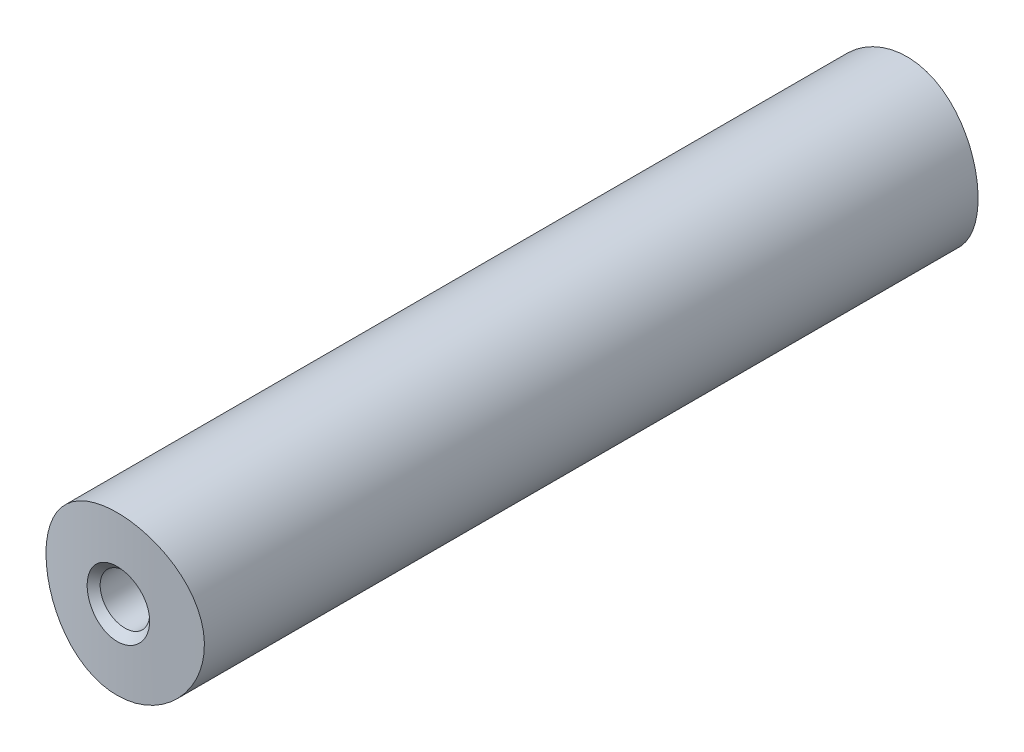
ISO-10303-21;
HEADER;
FILE_DESCRIPTION(('STEP AP214'),'2;1');
FILE_NAME('part.step','',(''),(''),'','','');
FILE_SCHEMA(('AUTOMOTIVE_DESIGN { 1 0 10303 214 1 1 1 1 }'));
ENDSEC;
DATA;
#1=APPLICATION_CONTEXT('core data for automotive mechanical design processes');
#2=APPLICATION_PROTOCOL_DEFINITION('international standard','automotive_design',2000,#1);
#3=PRODUCT_CONTEXT('',#1,'mechanical');
#4=PRODUCT('Part','Part','',(#3));
#5=PRODUCT_RELATED_PRODUCT_CATEGORY('part','',(#4));
#6=PRODUCT_DEFINITION_FORMATION('','',#4);
#7=PRODUCT_DEFINITION_CONTEXT('part definition',#1,'design');
#8=PRODUCT_DEFINITION('design','',#6,#7);
#9=PRODUCT_DEFINITION_SHAPE('','',#8);
#10=(LENGTH_UNIT() NAMED_UNIT(*) SI_UNIT(.MILLI.,.METRE.));
#11=(NAMED_UNIT(*) PLANE_ANGLE_UNIT() SI_UNIT($,.RADIAN.));
#12=(NAMED_UNIT(*) SI_UNIT($,.STERADIAN.) SOLID_ANGLE_UNIT());
#13=UNCERTAINTY_MEASURE_WITH_UNIT(LENGTH_MEASURE(1.E-05),#10,'distance_accuracy_value','');
#14=(GEOMETRIC_REPRESENTATION_CONTEXT(3) GLOBAL_UNCERTAINTY_ASSIGNED_CONTEXT((#13)) GLOBAL_UNIT_ASSIGNED_CONTEXT((#10,
#11,#12)) REPRESENTATION_CONTEXT('',''));
#15=CARTESIAN_POINT('',(0.,0.,0.));
#16=DIRECTION('',(0.,0.,1.));
#17=DIRECTION('',(1.,0.,0.));
#18=AXIS2_PLACEMENT_3D('',#15,#16,#17);
#19=CARTESIAN_POINT('',(0.,0.,63.5));
#20=DIRECTION('',(0.,0.,1.));
#21=DIRECTION('',(1.,0.,0.));
#22=AXIS2_PLACEMENT_3D('',#19,#20,#21);
#23=CONICAL_SURFACE('',#22,5.3975,0.785398163397447);
#24=CARTESIAN_POINT('',(0.,0.,62.07125));
#25=DIRECTION('',(0.,0.,1.));
#26=DIRECTION('',(1.,0.,0.));
#27=AXIS2_PLACEMENT_3D('',#24,#25,#26);
#28=CIRCLE('',#27,3.96875);
#29=CARTESIAN_POINT('',(3.96875,0.,62.07125));
#30=VERTEX_POINT('',#29);
#31=EDGE_CURVE('E60',#30,#30,#28,.T.);
#32=ORIENTED_EDGE('',*,*,#31,.F.);
#33=EDGE_LOOP('',(#32));
#34=FACE_BOUND('',#33,.T.);
#35=CARTESIAN_POINT('',(-3.60602534668571,-3.61242803920418,63.206719370434));
#36=CARTESIAN_POINT('',(-3.77760295855368,-3.42731673409778,63.1969309766532));
#37=CARTESIAN_POINT('',(-3.93553905102166,-3.22947273472196,63.1872198790944));
#38=CARTESIAN_POINT('',(-4.22122062674159,-2.81288180267858,63.1687789207255));
#39=CARTESIAN_POINT('',(-4.34893928616341,-2.59411653838965,63.1600499353077));
#40=CARTESIAN_POINT('',(-4.58956433848183,-2.10444538184426,63.1430563569257));
#41=CARTESIAN_POINT('',(-4.69690507763108,-1.83077398393217,63.1350852071329));
#42=CARTESIAN_POINT('',(-4.86547861927727,-1.26949010758867,63.1223184535103));
#43=CARTESIAN_POINT('',(-4.92669629620545,-0.981873088721641,63.117523891471));
#44=CARTESIAN_POINT('',(-5.00260471381052,-0.393325821332136,63.1115541593806));
#45=CARTESIAN_POINT('',(-5.01611810785411,-0.0922420517337446,63.1104705961284));
#46=CARTESIAN_POINT('',(-4.99302368432619,0.507984769910095,63.1123016823008));
#47=CARTESIAN_POINT('',(-4.95641426629581,0.807127759678545,63.1152164593955));
#48=CARTESIAN_POINT('',(-4.83338201435525,1.39754888855382,63.1247575964655));
#49=CARTESIAN_POINT('',(-4.74654850140856,1.68874120669659,63.1314145431463));
#50=CARTESIAN_POINT('',(-4.52476303749793,2.25213436252737,63.147696728003));
#51=CARTESIAN_POINT('',(-4.38981133141256,2.52433529685613,63.157321951073));
#52=CARTESIAN_POINT('',(-4.07690437453037,3.03839418538927,63.1782862189646));
#53=CARTESIAN_POINT('',(-3.89946858743486,3.28056877286937,63.1896039848341));
#54=CARTESIAN_POINT('',(-3.50526996280881,3.73047530307723,63.2126942858555));
#55=CARTESIAN_POINT('',(-3.28851338493232,3.93821271795424,63.2244667483877));
#56=CARTESIAN_POINT('',(-2.82872032636692,4.30637817021102,63.2466788517675));
#57=CARTESIAN_POINT('',(-2.58668595392283,4.46805496033761,63.2571481757345));
#58=CARTESIAN_POINT('',(-2.07798191115768,4.74657649142723,63.2758990287062));
#59=CARTESIAN_POINT('',(-1.81131863216506,4.86343282319681,63.2841811231671));
#60=CARTESIAN_POINT('',(-1.27220137907957,5.04427738865952,63.2972676894736));
#61=CARTESIAN_POINT('',(-1.00038565392854,5.11016092039337,63.3021959150789));
#62=CARTESIAN_POINT('',(-0.449435583687897,5.19404193543485,63.308503393541));
#63=CARTESIAN_POINT('',(-0.170302655873685,5.21204862384701,63.3098833286127));
#64=CARTESIAN_POINT('',(0.379168276851889,5.1996873056172,63.3089446219654));
#65=CARTESIAN_POINT('',(0.649537130030875,5.17063539148288,63.3067266021153));
#66=CARTESIAN_POINT('',(1.18152438875967,5.0676757417638,63.2990330406424));
#67=CARTESIAN_POINT('',(1.44314302648439,4.99376919733263,63.2935575855237));
#68=CARTESIAN_POINT('',(1.95059139991739,4.8036075124519,63.2799535760625));
#69=CARTESIAN_POINT('',(2.19641056837883,4.68732436872817,63.2718232677121));
#70=CARTESIAN_POINT('',(2.66570644289358,4.41624031614995,63.25379065775));
#71=CARTESIAN_POINT('',(2.88918061976764,4.26143505396633,63.2438881559009));
#72=CARTESIAN_POINT('',(3.31412461839851,3.91332720072715,63.2230648486549));
#73=CARTESIAN_POINT('',(3.51482443095939,3.7190866053989,63.2121235856695));
#74=CARTESIAN_POINT('',(3.88221353073627,3.30073653714501,63.1906255555674));
#75=CARTESIAN_POINT('',(4.04889672981935,3.07662172931886,63.1800688575555));
#76=CARTESIAN_POINT('',(4.35022974397913,2.59571806893855,63.1600509520674));
#77=CARTESIAN_POINT('',(4.48341506301654,2.33800894318803,63.1506468947028));
#78=CARTESIAN_POINT('',(4.70620691661886,1.80432214587199,63.1344353950988));
#79=CARTESIAN_POINT('',(4.79580619065201,1.52834143933275,63.1276283855142));
#80=CARTESIAN_POINT('',(4.93158775484625,0.956699245610834,63.1171694333618));
#81=CARTESIAN_POINT('',(4.97632650136816,0.660692283041629,63.1136226803174));
#82=CARTESIAN_POINT('',(5.01640668279668,0.0653205159824059,63.1104496854046));
#83=CARTESIAN_POINT('',(5.0117428667832,-0.234044642066765,63.1108238602855));
#84=CARTESIAN_POINT('',(4.95268630352276,-0.83217369491053,63.1154860457541));
#85=CARTESIAN_POINT('',(4.89757944509069,-1.13086704440573,63.1198302578448));
#86=CARTESIAN_POINT('',(4.73787916918234,-1.7146715750617,63.1320176429703));
#87=CARTESIAN_POINT('',(4.63328479542467,-1.99978249364261,63.139860883619));
#88=CARTESIAN_POINT('',(4.37774441718744,-2.54653710937548,63.1580904646702));
#89=CARTESIAN_POINT('',(4.22704446083415,-2.80829607304677,63.1684632476244));
#90=CARTESIAN_POINT('',(3.88279439363257,-3.30190973251088,63.1905557215462));
#91=CARTESIAN_POINT('',(3.68924891811088,-3.53376765891513,63.2022752667458));
#92=CARTESIAN_POINT('',(3.26970559353249,-3.9545600588366,63.2253488769219));
#93=CARTESIAN_POINT('',(3.04463878473248,-4.14442178871357,63.2367047606427));
#94=CARTESIAN_POINT('',(2.56470182567142,-4.48187561614785,63.2579846893504));
#95=CARTESIAN_POINT('',(2.30983884936819,-4.62947785903251,63.2679090777152));
#96=CARTESIAN_POINT('',(1.78802336022064,-4.87220440415218,63.2847629380258));
#97=CARTESIAN_POINT('',(1.52190902223555,-4.96912377411707,63.2917926484062));
#98=CARTESIAN_POINT('',(0.976838929683416,-5.11525450827294,63.3025493252972));
#99=CARTESIAN_POINT('',(0.69788646089051,-5.16447800933313,63.3062771320018));
#100=CARTESIAN_POINT('',(0.145145990127919,-5.21253224391281,63.3099167138425));
#101=CARTESIAN_POINT('',(-0.128499711801468,-5.21300371866441,63.309952735025));
#102=CARTESIAN_POINT('',(-0.671929034719876,-5.16765239471673,63.3065172632403));
#103=CARTESIAN_POINT('',(-0.94171241532517,-5.12182672716311,63.3030455529126));
#104=CARTESIAN_POINT('',(-1.46731050303049,-4.9861494332481,63.2930356397941));
#105=CARTESIAN_POINT('',(-1.72322749090946,-4.89668999321405,63.2865247753387));
#106=CARTESIAN_POINT('',(-2.21667690852546,-4.676987246549,63.2711629183678));
#107=CARTESIAN_POINT('',(-2.4542203432242,-4.54676859255177,63.2623133408922));
#108=CARTESIAN_POINT('',(-2.84913478377206,-4.28660943742977,63.2455860776333));
#109=CARTESIAN_POINT('',(-3.01179919110431,-4.16457380509138,63.2380097815346));
#110=CARTESIAN_POINT('',(-3.32125515663873,-3.90190937005276,63.2225120569026));
#111=CARTESIAN_POINT('',(-3.46805096110483,-3.76128556384315,63.214590721498));
#112=CARTESIAN_POINT('',(-3.60602534668571,-3.61242803920418,63.206719370434));
#113=B_SPLINE_CURVE_WITH_KNOTS('',3,(#35,#36,#37,#38,#39,#40,#41,#42,#43,#44,#45,#46,#47,#48,
#49,#50,#51,#52,#53,#54,#55,#56,#57,#58,#59,#60,#61,#62,#63,#64,#65,#66,#67,#68,#69,#70,#71,#72,
#73,#74,#75,#76,#77,#78,#79,#80,#81,#82,#83,#84,#85,#86,#87,#88,#89,#90,#91,#92,#93,#94,#95,#96,
#97,#98,#99,#100,#101,#102,#103,#104,#105,#106,#107,#108,#109,#110,#111,#112),.UNSPECIFIED.,.T.,
.F.,(4,2,2,2,2,2,2,2,2,2,2,2,2,2,2,2,2,2,2,2,2,2,2,2,2,2,2,2,2,2,2,2,2,2,2,2,2,2,4),(0.,
0.757200331035157,1.51507032317177,2.393190518203,3.27159855823975,4.17153984685982,
5.0715098719482,5.97894507042375,6.88637565093162,7.78323158939017,8.67994487840024,
9.54933262789738,10.4184953973124,11.2535385615298,12.0884211634567,12.9003549605438,
13.7122671969687,14.5247169364487,15.3372585314324,16.1720474991057,17.0069857425932,
17.8737736702442,18.740705937398,19.6347168133291,20.5288227132132,21.4357853792422,
22.3427655718522,23.244987574714,24.1471120165786,25.026709796165,25.906096231384,
26.7517663020991,27.597221123888,28.4142127161302,29.2312549372777,30.0410851515325,
30.8504264948603,31.4594936251633,32.0683973702312),.UNSPECIFIED.);
#114=CARTESIAN_POINT('',(-3.60602534668571,-3.61242803920418,63.206719370434));
#115=VERTEX_POINT('',#114);
#116=EDGE_CURVE('E103',#115,#115,#113,.T.);
#117=ORIENTED_EDGE('',*,*,#116,.F.);
#118=EDGE_LOOP('',(#117));
#119=FACE_BOUND('',#118,.T.);
#120=ADVANCED_FACE('F46',(#34,#119),#23,.F.);
#121=CARTESIAN_POINT('',(0.,0.,38.1));
#122=DIRECTION('',(0.,0.,1.));
#123=DIRECTION('',(1.,0.,0.));
#124=AXIS2_PLACEMENT_3D('',#121,#122,#123);
#125=CONICAL_SURFACE('',#124,3.96874999999999,1.02974425867665);
#126=CARTESIAN_POINT('',(0.,0.,35.7153344182344));
#127=VERTEX_POINT('',#126);
#128=VERTEX_LOOP('',#127);
#129=FACE_BOUND('',#128,.T.);
#130=CARTESIAN_POINT('',(0.,0.,38.1));
#131=DIRECTION('',(0.,0.,1.));
#132=DIRECTION('',(1.,0.,0.));
#133=AXIS2_PLACEMENT_3D('',#130,#131,#132);
#134=CIRCLE('',#133,3.96874999999999);
#135=CARTESIAN_POINT('',(3.96874999999999,0.,38.1));
#136=VERTEX_POINT('',#135);
#137=EDGE_CURVE('E12',#136,#136,#134,.T.);
#138=ORIENTED_EDGE('',*,*,#137,.T.);
#139=EDGE_LOOP('',(#138));
#140=FACE_BOUND('',#139,.T.);
#141=ADVANCED_FACE('F111',(#129,#140),#125,.F.);
#142=CARTESIAN_POINT('',(0.,0.,63.5));
#143=DIRECTION('',(0.,0.,1.));
#144=DIRECTION('',(1.,0.,0.));
#145=AXIS2_PLACEMENT_3D('',#142,#143,#144);
#146=CYLINDRICAL_SURFACE('',#145,3.96874999999999);
#147=ORIENTED_EDGE('',*,*,#137,.F.);
#148=EDGE_LOOP('',(#147));
#149=FACE_BOUND('',#148,.T.);
#150=ORIENTED_EDGE('',*,*,#31,.T.);
#151=EDGE_LOOP('',(#150));
#152=FACE_BOUND('',#151,.T.);
#153=ADVANCED_FACE('F95',(#149,#152),#146,.F.);
#154=CARTESIAN_POINT('',(0.,-12.7,0.));
#155=DIRECTION('',(0.,1.,0.));
#156=DIRECTION('',(0.,0.,1.));
#157=AXIS2_PLACEMENT_3D('',#154,#155,#156);
#158=CYLINDRICAL_SURFACE('',#157,63.3095);
#159=ORIENTED_EDGE('',*,*,#116,.T.);
#160=EDGE_LOOP('',(#159));
#161=FACE_BOUND('',#160,.T.);
#162=CARTESIAN_POINT('',(0.,-12.7,63.3095));
#163=CARTESIAN_POINT('',(0.352673540748719,-12.6999983594685,63.3094991812917));
#164=CARTESIAN_POINT('',(0.705390037672759,-12.6852972034763,63.3065455466223));
#165=CARTESIAN_POINT('',(1.40841467835114,-12.6265938691281,63.2948090697052));
#166=CARTESIAN_POINT('',(1.75872166189346,-12.5825784542778,63.2860235941673));
#167=CARTESIAN_POINT('',(2.45488375706009,-12.4654859362916,63.2628471669451));
#168=CARTESIAN_POINT('',(2.80073012784159,-12.3923587357919,63.2484465532652));
#169=CARTESIAN_POINT('',(3.48489641792108,-12.217616862079,63.2144415203925));
#170=CARTESIAN_POINT('',(3.82321606053278,-12.1160011434751,63.1948369102397));
#171=CARTESIAN_POINT('',(4.48946044914931,-11.8852365227285,63.151000260803));
#172=CARTESIAN_POINT('',(4.81739970819967,-11.7561282062579,63.1267750480759));
#173=CARTESIAN_POINT('',(5.46116219426159,-11.471251439701,63.0743435136026));
#174=CARTESIAN_POINT('',(5.77698509789749,-11.3154822786636,63.0461370856948));
#175=CARTESIAN_POINT('',(6.39426969245499,-10.9784755763954,62.9865242280787));
#176=CARTESIAN_POINT('',(6.69573645349596,-10.7972471172231,62.9551189405884));
#177=CARTESIAN_POINT('',(7.28242785353189,-10.4105562250777,62.8899528088152));
#178=CARTESIAN_POINT('',(7.56765260030009,-10.2050939529349,62.8561919801656));
#179=CARTESIAN_POINT('',(8.12339747151626,-9.76866298785964,62.7868027339776));
#180=CARTESIAN_POINT('',(8.39369303629189,-9.53741114108556,62.7511564269631));
#181=CARTESIAN_POINT('',(8.91391017787619,-9.05309371975586,62.6793742742274));
#182=CARTESIAN_POINT('',(9.16383156318968,-8.80002794021893,62.6432384239087));
#183=CARTESIAN_POINT('',(9.64164155828114,-8.27375842014614,62.5714785309031));
#184=CARTESIAN_POINT('',(9.86952732858199,-8.00055209230139,62.5358545546778));
#185=CARTESIAN_POINT('',(10.3016662470973,-7.43586425776115,62.4661218726317));
#186=CARTESIAN_POINT('',(10.5059193287859,-7.14438269962457,62.4320131710764));
#187=CARTESIAN_POINT('',(10.8911164288901,-6.54235801263415,62.3659756960723));
#188=CARTESIAN_POINT('',(11.0718298521442,-6.23166476403719,62.3340697470942));
#189=CARTESIAN_POINT('',(11.4063997895598,-5.59581139002088,62.2737163385972));
#190=CARTESIAN_POINT('',(11.560256091781,-5.27065115046216,62.2452689063715));
#191=CARTESIAN_POINT('',(11.8399294759462,-4.60818053133427,62.1926773817018));
#192=CARTESIAN_POINT('',(11.9657489613547,-4.27087119613193,62.1685329204199));
#193=CARTESIAN_POINT('',(12.1883763028003,-3.58649685708225,62.1252697960758));
#194=CARTESIAN_POINT('',(12.285184594346,-3.23943199976788,62.1061510575693));
#195=CARTESIAN_POINT('',(12.447929270234,-2.54270437284621,62.0737355610236));
#196=CARTESIAN_POINT('',(12.5142556304654,-2.19313609211438,62.0603654090433));
#197=CARTESIAN_POINT('',(12.6173624641664,-1.48949502512245,62.0394852473924));
#198=CARTESIAN_POINT('',(12.6541431717055,-1.13542227457069,62.0319751912964));
#199=CARTESIAN_POINT('',(12.6978558237253,-0.425393837761971,62.0230420709459));
#200=CARTESIAN_POINT('',(12.7047904175096,-0.0694383214380535,62.0216184664249));
#201=CARTESIAN_POINT('',(12.6887606911102,0.641768727722801,62.0248999172035));
#202=CARTESIAN_POINT('',(12.665796623324,0.9970202664772,62.0296049207669));
#203=CARTESIAN_POINT('',(12.5907354093947,1.69883187189463,62.0448838001602));
#204=CARTESIAN_POINT('',(12.5390865159801,2.04544196282613,62.0553673570335));
#205=CARTESIAN_POINT('',(12.4073852449257,2.73300409027067,62.0818337862419));
#206=CARTESIAN_POINT('',(12.3273331986839,3.07395619275057,62.0978165944136));
#207=CARTESIAN_POINT('',(12.139440380071,3.74784640233725,62.1348206296469));
#208=CARTESIAN_POINT('',(12.0315984764546,4.08078418260059,62.1558420618139));
#209=CARTESIAN_POINT('',(11.7889386487514,4.73635883919277,62.2023228171721));
#210=CARTESIAN_POINT('',(11.6541204447492,5.05899560859447,62.2277821864124));
#211=CARTESIAN_POINT('',(11.3574840995939,5.69396035573169,62.2826078144263));
#212=CARTESIAN_POINT('',(11.1954881484925,6.00620305533212,62.3119995256765));
#213=CARTESIAN_POINT('',(10.8463106430054,6.61596419261479,62.3737264698714));
#214=CARTESIAN_POINT('',(10.6591290124136,6.9134825857409,62.4060617117224));
#215=CARTESIAN_POINT('',(10.2608769660525,7.49184107813482,62.4727776120807));
#216=CARTESIAN_POINT('',(10.0498060063843,7.77268079744983,62.5071583171496));
#217=CARTESIAN_POINT('',(9.60520708953521,8.31583871801013,62.5770198238693));
#218=CARTESIAN_POINT('',(9.37167882835173,8.57815666844444,62.6125006404079));
#219=CARTESIAN_POINT('',(8.87933677416821,9.08707667099444,62.6842335921908));
#220=CARTESIAN_POINT('',(8.62014460729177,9.33331248678523,62.7204881482588));
#221=CARTESIAN_POINT('',(8.08185631943327,9.80312304974522,62.7921180952726));
#222=CARTESIAN_POINT('',(7.80275980904879,10.0266973533643,62.8274934690001));
#223=CARTESIAN_POINT('',(7.22642685581541,10.4497170841558,62.8963893425174));
#224=CARTESIAN_POINT('',(6.92918220224661,10.6491514662277,62.9299089894512));
#225=CARTESIAN_POINT('',(6.31870675666922,11.0223375950364,62.9941339854091));
#226=CARTESIAN_POINT('',(6.0054764847973,11.1960901766864,63.0248394259106));
#227=CARTESIAN_POINT('',(5.36441400339385,11.5170247796731,63.0826415251039));
#228=CARTESIAN_POINT('',(5.03654848472293,11.6641418871029,63.1097293261533));
#229=CARTESIAN_POINT('',(4.36923856357976,11.9301618746599,63.1594368665794));
#230=CARTESIAN_POINT('',(4.02979440154406,12.0490653402507,63.1820566986696));
#231=CARTESIAN_POINT('',(3.34240724891612,12.257531361659,63.2221434064375));
#232=CARTESIAN_POINT('',(2.99448112825346,12.3471477478029,63.2396197300543));
#233=CARTESIAN_POINT('',(2.2921997004159,12.496583974189,63.2689656185244));
#234=CARTESIAN_POINT('',(1.93784753408022,12.556417984818,63.2808378496531));
#235=CARTESIAN_POINT('',(1.31938461667403,12.6340446213475,63.2962943656425));
#236=CARTESIAN_POINT('',(1.05615577939086,12.6587669214182,63.3012394029244));
#237=CARTESIAN_POINT('',(0.5286260057192,12.6917452369897,63.3078425291983));
#238=CARTESIAN_POINT('',(0.26432506783829,12.7000012295609,63.3095006136132));
#239=CARTESIAN_POINT('',(-0.352673540748721,12.6999983594685,63.3094991812917));
#240=CARTESIAN_POINT('',(-0.705390037672762,12.6852972034763,63.3065455466223));
#241=CARTESIAN_POINT('',(-1.40841467835114,12.6265938691281,63.2948090697052));
#242=CARTESIAN_POINT('',(-1.75872166189346,12.5825784542778,63.2860235941673));
#243=CARTESIAN_POINT('',(-2.45488375706009,12.4654859362916,63.2628471669451));
#244=CARTESIAN_POINT('',(-2.80073012784159,12.3923587357919,63.2484465532652));
#245=CARTESIAN_POINT('',(-3.48489641792108,12.217616862079,63.2144415203925));
#246=CARTESIAN_POINT('',(-3.82321606053278,12.1160011434751,63.1948369102397));
#247=CARTESIAN_POINT('',(-4.48946044914931,11.8852365227285,63.151000260803));
#248=CARTESIAN_POINT('',(-4.81739970819967,11.7561282062579,63.1267750480759));
#249=CARTESIAN_POINT('',(-5.46116219426159,11.471251439701,63.0743435136026));
#250=CARTESIAN_POINT('',(-5.77698509789748,11.3154822786636,63.0461370856948));
#251=CARTESIAN_POINT('',(-6.39426969245499,10.9784755763954,62.9865242280787));
#252=CARTESIAN_POINT('',(-6.69573645349596,10.7972471172231,62.9551189405884));
#253=CARTESIAN_POINT('',(-7.28242785353189,10.4105562250777,62.8899528088152));
#254=CARTESIAN_POINT('',(-7.56765260030009,10.2050939529349,62.8561919801656));
#255=CARTESIAN_POINT('',(-8.12339747151626,9.76866298785964,62.7868027339776));
#256=CARTESIAN_POINT('',(-8.39369303629189,9.53741114108556,62.7511564269631));
#257=CARTESIAN_POINT('',(-8.91391017787619,9.05309371975586,62.6793742742274));
#258=CARTESIAN_POINT('',(-9.16383156318968,8.80002794021893,62.6432384239087));
#259=CARTESIAN_POINT('',(-9.64164155828114,8.27375842014614,62.5714785309031));
#260=CARTESIAN_POINT('',(-9.86952732858199,8.00055209230139,62.5358545546778));
#261=CARTESIAN_POINT('',(-10.3016662470973,7.43586425776115,62.4661218726317));
#262=CARTESIAN_POINT('',(-10.5059193287859,7.14438269962457,62.4320131710764));
#263=CARTESIAN_POINT('',(-10.8911164288901,6.54235801263415,62.3659756960723));
#264=CARTESIAN_POINT('',(-11.0718298521442,6.23166476403719,62.3340697470942));
#265=CARTESIAN_POINT('',(-11.4063997895598,5.59581139002088,62.2737163385972));
#266=CARTESIAN_POINT('',(-11.560256091781,5.27065115046215,62.2452689063715));
#267=CARTESIAN_POINT('',(-11.8399294759462,4.60818053133427,62.1926773817018));
#268=CARTESIAN_POINT('',(-11.9657489613547,4.27087119613193,62.1685329204199));
#269=CARTESIAN_POINT('',(-12.1883763028003,3.58649685708226,62.1252697960758));
#270=CARTESIAN_POINT('',(-12.285184594346,3.23943199976788,62.1061510575693));
#271=CARTESIAN_POINT('',(-12.447929270234,2.54270437284621,62.0737355610236));
#272=CARTESIAN_POINT('',(-12.5142556304654,2.19313609211438,62.0603654090433));
#273=CARTESIAN_POINT('',(-12.6173624641664,1.48949502512245,62.0394852473924));
#274=CARTESIAN_POINT('',(-12.6541431717055,1.13542227457069,62.0319751912964));
#275=CARTESIAN_POINT('',(-12.6978558237253,0.425393837761973,62.0230420709459));
#276=CARTESIAN_POINT('',(-12.7047904175096,0.0694383214380534,62.0216184664249));
#277=CARTESIAN_POINT('',(-12.6887606911102,-0.641768727722803,62.0248999172035));
#278=CARTESIAN_POINT('',(-12.665796623324,-0.9970202664772,62.0296049207669));
#279=CARTESIAN_POINT('',(-12.5907354093947,-1.69883187189463,62.0448838001602));
#280=CARTESIAN_POINT('',(-12.5390865159801,-2.04544196282613,62.0553673570335));
#281=CARTESIAN_POINT('',(-12.4073852449257,-2.73300409027067,62.0818337862419));
#282=CARTESIAN_POINT('',(-12.3273331986839,-3.07395619275057,62.0978165944136));
#283=CARTESIAN_POINT('',(-12.139440380071,-3.74784640233725,62.1348206296469));
#284=CARTESIAN_POINT('',(-12.0315984764546,-4.08078418260059,62.1558420618139));
#285=CARTESIAN_POINT('',(-11.7889386487514,-4.73635883919277,62.2023228171721));
#286=CARTESIAN_POINT('',(-11.6541204447492,-5.05899560859447,62.2277821864124));
#287=CARTESIAN_POINT('',(-11.3574840995939,-5.69396035573169,62.2826078144263));
#288=CARTESIAN_POINT('',(-11.1954881484925,-6.00620305533212,62.3119995256765));
#289=CARTESIAN_POINT('',(-10.8463106430054,-6.61596419261478,62.3737264698714));
#290=CARTESIAN_POINT('',(-10.6591290124136,-6.91348258574089,62.4060617117223));
#291=CARTESIAN_POINT('',(-10.2608769660525,-7.49184107813482,62.4727776120807));
#292=CARTESIAN_POINT('',(-10.0498060063843,-7.77268079744983,62.5071583171496));
#293=CARTESIAN_POINT('',(-9.60520708953522,-8.31583871801013,62.5770198238693));
#294=CARTESIAN_POINT('',(-9.37167882835173,-8.57815666844444,62.6125006404079));
#295=CARTESIAN_POINT('',(-8.87933677416821,-9.08707667099444,62.6842335921908));
#296=CARTESIAN_POINT('',(-8.62014460729178,-9.33331248678522,62.7204881482588));
#297=CARTESIAN_POINT('',(-8.08185631943328,-9.80312304974521,62.7921180952726));
#298=CARTESIAN_POINT('',(-7.8027598090488,-10.0266973533643,62.8274934690001));
#299=CARTESIAN_POINT('',(-7.22642685581542,-10.4497170841558,62.8963893425174));
#300=CARTESIAN_POINT('',(-6.92918220224662,-10.6491514662277,62.9299089894512));
#301=CARTESIAN_POINT('',(-6.31870675666922,-11.0223375950364,62.9941339854091));
#302=CARTESIAN_POINT('',(-6.0054764847973,-11.1960901766864,63.0248394259106));
#303=CARTESIAN_POINT('',(-5.36441400339385,-11.5170247796731,63.0826415251039));
#304=CARTESIAN_POINT('',(-5.03654848472294,-11.6641418871029,63.1097293261533));
#305=CARTESIAN_POINT('',(-4.36923856357977,-11.9301618746599,63.1594368665794));
#306=CARTESIAN_POINT('',(-4.02979440154406,-12.0490653402507,63.1820566986696));
#307=CARTESIAN_POINT('',(-3.34240724891613,-12.257531361659,63.2221434064375));
#308=CARTESIAN_POINT('',(-2.99448112825346,-12.3471477478029,63.2396197300543));
#309=CARTESIAN_POINT('',(-2.2921997004159,-12.496583974189,63.2689656185244));
#310=CARTESIAN_POINT('',(-1.93784753408022,-12.556417984818,63.2808378496531));
#311=CARTESIAN_POINT('',(-1.31938461667403,-12.6340446213475,63.2962943656425));
#312=CARTESIAN_POINT('',(-1.05615577939087,-12.6587669214182,63.3012394029244));
#313=CARTESIAN_POINT('',(-0.528626005719202,-12.6917452369897,63.3078425291983));
#314=CARTESIAN_POINT('',(-0.264325067838291,-12.7000012295609,63.3095006136132));
#315=CARTESIAN_POINT('',(0.,-12.7,63.3095));
#316=B_SPLINE_CURVE_WITH_KNOTS('',3,(#162,#163,#164,#165,#166,#167,#168,#169,#170,#171,#172,
#173,#174,#175,#176,#177,#178,#179,#180,#181,#182,#183,#184,#185,#186,#187,#188,#189,#190,#191,
#192,#193,#194,#195,#196,#197,#198,#199,#200,#201,#202,#203,#204,#205,#206,#207,#208,#209,#210,
#211,#212,#213,#214,#215,#216,#217,#218,#219,#220,#221,#222,#223,#224,#225,#226,#227,#228,#229,
#230,#231,#232,#233,#234,#235,#236,#237,#238,#239,#240,#241,#242,#243,#244,#245,#246,#247,#248,
#249,#250,#251,#252,#253,#254,#255,#256,#257,#258,#259,#260,#261,#262,#263,#264,#265,#266,#267,
#268,#269,#270,#271,#272,#273,#274,#275,#276,#277,#278,#279,#280,#281,#282,#283,#284,#285,#286,
#287,#288,#289,#290,#291,#292,#293,#294,#295,#296,#297,#298,#299,#300,#301,#302,#303,#304,#305,
#306,#307,#308,#309,#310,#311,#312,#313,#314,#315),.UNSPECIFIED.,.T.,.F.,(4,2,2,2,2,2,2,2,2,2,2,
2,2,2,2,2,2,2,2,2,2,2,2,2,2,2,2,2,2,2,2,2,2,2,2,2,2,2,2,2,2,2,2,2,2,2,2,2,2,2,2,2,2,2,2,2,2,2,2,
2,2,2,2,2,2,2,2,2,2,2,2,2,2,2,2,2,4),(0.,1.05777729237092,2.11603253523164,3.17611681637497,
4.2362400025697,5.29480890963324,6.35340604941139,7.41162651179248,8.46983995157524,
9.54109577262536,10.6123616611569,11.683765408,12.7551721707641,13.836390887186,
14.9176181355495,15.9987526596941,17.0798709533091,18.1467438888952,19.2136083723099,
20.280378153068,21.3471389284606,22.3976804944314,23.4482098034525,24.4987818832617,
25.5493648647364,26.6071103626425,27.6648590611185,28.7226318466742,29.7804189532256,
30.8571771931771,31.9339565042748,33.0112266428091,34.0884617516761,35.1682878751251,
36.2480915890573,37.3258992879847,38.403193677073,39.195985403456,39.9887782338174,
41.0465555261883,42.1048107690491,43.1648950501924,44.2250182363871,45.2835871434507,
46.3421842832288,47.4004047456099,48.4586181853927,49.5298740064428,50.6011398949744,
51.6725436418174,52.7439504045816,53.8251691210034,54.906396369367,55.9875308935115,
57.0686491871265,58.1355221227126,59.2023866061273,60.2691563868854,61.3359171622781,
62.3864587282488,63.43698803727,64.4875601170791,65.5381430985538,66.5958885964599,
67.6536372949359,68.7114100804916,69.769197187043,70.8459554269945,71.9227347380922,
73.0000048766266,74.0772399854935,75.1570661089425,76.2368698228748,77.3146775218022,
78.3919719108904,79.1847636372735,79.9775564676349),.UNSPECIFIED.);
#317=CARTESIAN_POINT('',(0.,-12.7,63.3095));
#318=VERTEX_POINT('',#317);
#319=EDGE_CURVE('E81',#318,#318,#316,.T.);
#320=ORIENTED_EDGE('',*,*,#319,.T.);
#321=EDGE_LOOP('',(#320));
#322=FACE_BOUND('',#321,.T.);
#323=ADVANCED_FACE('F92',(#161,#322),#158,.T.);
#324=CARTESIAN_POINT('',(0.,0.,63.5));
#325=DIRECTION('',(0.,0.,-1.));
#326=DIRECTION('',(-1.,0.,0.));
#327=AXIS2_PLACEMENT_3D('',#324,#325,#326);
#328=CYLINDRICAL_SURFACE('',#327,12.7);
#329=CARTESIAN_POINT('',(-12.7,0.,-62.0225990284993));
#330=CARTESIAN_POINT('',(-12.7000070921043,0.352928941316335,-62.0225951543709));
#331=CARTESIAN_POINT('',(-12.6852845024944,0.705769472110787,-62.0256170434661));
#332=CARTESIAN_POINT('',(-12.6265255581717,1.40900508576085,-62.0376064858738));
#333=CARTESIAN_POINT('',(-12.5824842643912,1.75939974653038,-62.0465750409683));
#334=CARTESIAN_POINT('',(-12.4653881797209,2.45534652386929,-62.0702056415191));
#335=CARTESIAN_POINT('',(-12.3923133584452,2.80089512636565,-62.0848716175008));
#336=CARTESIAN_POINT('',(-12.2177283528025,3.48447256139583,-62.1194640878328));
#337=CARTESIAN_POINT('',(-12.1162174427589,3.82250120178583,-62.1393907164319));
#338=CARTESIAN_POINT('',(-11.8856624677299,4.4883207120549,-62.1839012356727));
#339=CARTESIAN_POINT('',(-11.756646941893,4.81612179308875,-62.2084802959489));
#340=CARTESIAN_POINT('',(-11.4719830969492,5.45961402088759,-62.2616040919129));
#341=CARTESIAN_POINT('',(-11.3163345368174,5.7753050580269,-62.2901488634894));
#342=CARTESIAN_POINT('',(-10.9795430885698,6.3924326493055,-62.3503943076076));
#343=CARTESIAN_POINT('',(-10.7984020332326,6.69387022611522,-62.3820947532249));
#344=CARTESIAN_POINT('',(-10.4118890935715,7.28051885950099,-62.4477683057942));
#345=CARTESIAN_POINT('',(-10.2065173623796,7.56573001860706,-62.4817413983831));
#346=CARTESIAN_POINT('',(-9.77016898996287,8.12159041692716,-62.5514668737166));
#347=CARTESIAN_POINT('',(-9.53889875698732,8.39200707472866,-62.5872364427235));
#348=CARTESIAN_POINT('',(-9.05451951337828,8.91246624933632,-62.6591445749495));
#349=CARTESIAN_POINT('',(-8.80141031738634,9.16250859318022,-62.6952831412981));
#350=CARTESIAN_POINT('',(-8.275043867816,9.6405420226398,-62.7669258049918));
#351=CARTESIAN_POINT('',(-8.00178523357542,9.86853159469567,-62.8024298586518));
#352=CARTESIAN_POINT('',(-7.43697090018735,10.3008711986992,-62.8718155937985));
#353=CARTESIAN_POINT('',(-7.14541515496477,10.5052211711148,-62.9056972711995));
#354=CARTESIAN_POINT('',(-6.54333234459696,10.8905307815323,-62.9711844806783));
#355=CARTESIAN_POINT('',(-6.23266097326704,11.0712688832484,-63.0027673720273));
#356=CARTESIAN_POINT('',(-5.59684909437635,11.4058904470476,-63.0624294610394));
#357=CARTESIAN_POINT('',(-5.27170847571223,11.5597737028787,-63.0905086317927));
#358=CARTESIAN_POINT('',(-4.6092747833793,11.8395034192051,-63.1423608236486));
#359=CARTESIAN_POINT('',(-4.27198259655801,11.9653519209409,-63.1661341582401));
#360=CARTESIAN_POINT('',(-3.58764734581192,12.1880374306419,-63.2086947364803));
#361=CARTESIAN_POINT('',(-3.2406044252975,12.2848748650478,-63.2274820534191));
#362=CARTESIAN_POINT('',(-2.54395272870419,12.4476729465671,-63.2593159976903));
#363=CARTESIAN_POINT('',(-2.19443890225354,12.514025768619,-63.2724354016505));
#364=CARTESIAN_POINT('',(-1.49091125277252,12.6171937448649,-63.2929206608798));
#365=CARTESIAN_POINT('',(-1.13689746558602,12.654009134186,-63.3002865619485));
#366=CARTESIAN_POINT('',(-0.426985554309012,12.697800858415,-63.3090552375658));
#367=CARTESIAN_POINT('',(-0.0710875928388892,12.7047797277502,-63.310458518602));
#368=CARTESIAN_POINT('',(0.640010046253887,12.688847961929,-63.3072633383405));
#369=CARTESIAN_POINT('',(0.995209729329494,12.6659375611182,-63.3026649240989));
#370=CARTESIAN_POINT('',(1.69723146300331,12.5909582559513,-63.2877057475103));
#371=CARTESIAN_POINT('',(2.04410059003669,12.5393124772128,-63.2774286184789));
#372=CARTESIAN_POINT('',(2.73218234005707,12.4075735282934,-63.2514545757219));
#373=CARTESIAN_POINT('',(3.07339502612453,12.3274806755772,-63.2357577224794));
#374=CARTESIAN_POINT('',(3.74779749937766,12.1394629940182,-63.1993738414484));
#375=CARTESIAN_POINT('',(4.08098707596089,12.0315374354504,-63.1786866828235));
#376=CARTESIAN_POINT('',(4.73705388132756,11.788667300774,-63.1328856875502));
#377=CARTESIAN_POINT('',(5.05993100961739,11.6537224614588,-63.1077718077793));
#378=CARTESIAN_POINT('',(5.69520114364831,11.3568650420334,-63.0536260029076));
#379=CARTESIAN_POINT('',(6.00751495663534,11.1947873523264,-63.0245703098189));
#380=CARTESIAN_POINT('',(6.61740455157142,10.845435137733,-62.9634551863049));
#381=CARTESIAN_POINT('',(6.91498029721959,10.6581605507892,-62.9313957484817));
#382=CARTESIAN_POINT('',(7.49345661691583,10.2597013307022,-62.8651388095553));
#383=CARTESIAN_POINT('',(7.77435556897403,10.0485143776235,-62.8309411011452));
#384=CARTESIAN_POINT('',(8.31760775460774,9.60367930126638,-62.761335243394));
#385=CARTESIAN_POINT('',(8.57996075669563,9.37003089771357,-62.7259270789524));
#386=CARTESIAN_POINT('',(9.08882987871934,8.87754086669387,-62.6542349043412));
#387=CARTESIAN_POINT('',(9.33498723937849,8.61832905116782,-62.6179464291258));
#388=CARTESIAN_POINT('',(9.80463347160282,8.08002173685416,-62.5461302064708));
#389=CARTESIAN_POINT('',(10.0281220653155,7.80092599441936,-62.5106024683598));
#390=CARTESIAN_POINT('',(10.4508787940553,7.22473618074064,-62.4413150242399));
#391=CARTESIAN_POINT('',(10.6501463227842,6.92764165923264,-62.4075553625013));
#392=CARTESIAN_POINT('',(11.0230314796145,6.31748438568012,-62.3427733943687));
#393=CARTESIAN_POINT('',(11.196649208719,6.00442169652105,-62.3117510771959));
#394=CARTESIAN_POINT('',(11.5173098149019,5.36378247441328,-62.2532810412686));
#395=CARTESIAN_POINT('',(11.6642937896836,5.03617571981034,-62.2258412821175));
#396=CARTESIAN_POINT('',(11.9300977659927,4.36939109550805,-62.1754281974201));
#397=CARTESIAN_POINT('',(12.0489176704983,4.03021318595214,-62.1524548872602));
#398=CARTESIAN_POINT('',(12.2574458616686,3.34275716825175,-62.1116664544993));
#399=CARTESIAN_POINT('',(12.3471572762728,2.99448004223949,-62.0938507776917));
#400=CARTESIAN_POINT('',(12.4967578642722,2.29133876751762,-62.0639159608186));
#401=CARTESIAN_POINT('',(12.5566475209992,1.93647472566119,-62.0517967284289));
#402=CARTESIAN_POINT('',(12.6453400564774,1.22894157742466,-62.0337825456342));
#403=CARTESIAN_POINT('',(12.674660530425,0.876339915294061,-62.0277839988144));
#404=CARTESIAN_POINT('',(12.7037839465264,0.169870355337687,-62.0218259035732));
#405=CARTESIAN_POINT('',(12.7035872256552,-0.183997527986505,-62.02186628621));
#406=CARTESIAN_POINT('',(12.6736791032594,-0.890410993712323,-62.0279846394225));
#407=CARTESIAN_POINT('',(12.6439692812246,-1.24295664586393,-62.0340622868943));
#408=CARTESIAN_POINT('',(12.5552782143439,-1.944193438002,-62.0520734683231));
#409=CARTESIAN_POINT('',(12.4962970326174,-2.29288458629846,-62.0640069896527));
#410=CARTESIAN_POINT('',(12.3502468559029,-2.98056479762842,-62.0932337116632));
#411=CARTESIAN_POINT('',(12.2634553181661,-3.31961510774265,-62.1104739046943));
#412=CARTESIAN_POINT('',(12.0622956487164,-3.98913580450017,-62.149853637528));
#413=CARTESIAN_POINT('',(11.9479277486965,-4.31960626320445,-62.1719931361672));
#414=CARTESIAN_POINT('',(11.6924608846457,-4.96974383598404,-62.2205435622331));
#415=CARTESIAN_POINT('',(11.5513602331343,-5.28941026656302,-62.2469547592915));
#416=CARTESIAN_POINT('',(11.2434529969119,-5.91578896448285,-62.30330678523));
#417=CARTESIAN_POINT('',(11.0766460658297,-6.22250105720354,-62.3332476616684));
#418=CARTESIAN_POINT('',(10.716147410823,-6.82488080038102,-62.3962409077115));
#419=CARTESIAN_POINT('',(10.5221319930393,-7.12035102460447,-62.4293289130359));
#420=CARTESIAN_POINT('',(10.1102727528102,-7.69396213542761,-62.4973497244941));
#421=CARTESIAN_POINT('',(9.89242875427558,-7.97210289394163,-62.5322825442598));
#422=CARTESIAN_POINT('',(9.43437569264167,-8.50923897714379,-62.6030273848666));
#423=CARTESIAN_POINT('',(9.19416456716771,-8.76823253239464,-62.6388394865577));
#424=CARTESIAN_POINT('',(8.6930024806432,-9.26532660061438,-62.7103544319378));
#425=CARTESIAN_POINT('',(8.43205140524966,-9.5034269983804,-62.7460572750233));
#426=CARTESIAN_POINT('',(7.88694919592852,-9.96064886164471,-62.81692053916));
#427=CARTESIAN_POINT('',(7.60250151755725,-10.1794195828613,-62.85206401464));
#428=CARTESIAN_POINT('',(7.01594298276855,-10.5922216712842,-62.9202391422605));
#429=CARTESIAN_POINT('',(6.71383192031675,-10.7862527498311,-62.953270769758));
#430=CARTESIAN_POINT('',(6.09403552702484,-11.1481615676868,-63.0162878251468));
#431=CARTESIAN_POINT('',(5.77635062496714,-11.3160400265041,-63.0462733368347));
#432=CARTESIAN_POINT('',(5.12761731397435,-11.6243933431298,-63.1023479167779));
#433=CARTESIAN_POINT('',(4.79656904126891,-11.7648684802096,-63.1284370247414));
#434=CARTESIAN_POINT('',(4.12540004852667,-12.016604810377,-63.1758369824249));
#435=CARTESIAN_POINT('',(3.78534269405626,-12.1280298825108,-63.1971745327198));
#436=CARTESIAN_POINT('',(3.09676941030679,-12.3218480922971,-63.2346556920431));
#437=CARTESIAN_POINT('',(2.74825349881146,-12.404241290982,-63.2507993119905));
#438=CARTESIAN_POINT('',(2.04533390545462,-12.5393254106716,-63.2774294784512));
#439=CARTESIAN_POINT('',(1.69093082446802,-12.592019343993,-63.2879165986834));
#440=CARTESIAN_POINT('',(0.978816511617573,-12.6672848657746,-63.3029346116698));
#441=CARTESIAN_POINT('',(0.621105324265686,-12.6898568589461,-63.3074655844495));
#442=CARTESIAN_POINT('',(-0.0886901066347457,-12.7045632612709,-63.3104151987255));
#443=CARTESIAN_POINT('',(-0.440763114941254,-12.6972240929789,-63.3089395544643));
#444=CARTESIAN_POINT('',(-1.14300854859863,-12.6533511927584,-63.3001550174417));
#445=CARTESIAN_POINT('',(-1.49318099762918,-12.6168178254143,-63.2928461975266));
#446=CARTESIAN_POINT('',(-2.18911824161811,-12.5148488983231,-63.2725986653296));
#447=CARTESIAN_POINT('',(-2.53488311454419,-12.4494138505634,-63.2596600527784));
#448=CARTESIAN_POINT('',(-3.21956828889219,-12.2901554473347,-63.228511133486));
#449=CARTESIAN_POINT('',(-3.55848856396219,-12.1963319825914,-63.2103008064526));
#450=CARTESIAN_POINT('',(-4.22634540128656,-11.9812684108589,-63.1691576576416));
#451=CARTESIAN_POINT('',(-4.55530330480649,-11.860092426258,-63.1462358919281));
#452=CARTESIAN_POINT('',(-5.20181302292759,-11.5911054315713,-63.0962682101664));
#453=CARTESIAN_POINT('',(-5.51936487697876,-11.4432945136181,-63.0692223083839));
#454=CARTESIAN_POINT('',(-6.14095809186911,-11.1220964261279,-63.0117359264285));
#455=CARTESIAN_POINT('',(-6.44499865213895,-10.9487077436829,-62.9812952454827));
#456=CARTESIAN_POINT('',(-7.03755000327061,-10.5775757663573,-62.9178391548595));
#457=CARTESIAN_POINT('',(-7.32606059025193,-10.3798321518524,-62.8848237113942));
#458=CARTESIAN_POINT('',(-7.89021500436134,-9.95794031938354,-62.8165531280331));
#459=CARTESIAN_POINT('',(-8.16557406823624,-9.73341569836744,-62.7812703377984));
#460=CARTESIAN_POINT('',(-8.69646948440418,-9.26214923739988,-62.7099351238999));
#461=CARTESIAN_POINT('',(-8.95200558009502,-9.01540710993897,-62.6738826902811));
#462=CARTESIAN_POINT('',(-9.44159372413452,-8.50131360604535,-62.6019995283432));
#463=CARTESIAN_POINT('',(-9.67564069507677,-8.23395738627019,-62.5661688542766));
#464=CARTESIAN_POINT('',(-10.1205866224071,-7.68048209473229,-62.4957379958736));
#465=CARTESIAN_POINT('',(-10.3314857376944,-7.39436315178845,-62.4611378030917));
#466=CARTESIAN_POINT('',(-10.7308362788259,-6.80206619038677,-62.3937770280434));
#467=CARTESIAN_POINT('',(-10.9190183605595,-6.49570372253583,-62.3610405707268));
#468=CARTESIAN_POINT('',(-11.2688561981539,-5.86788081297703,-62.2987740593029));
#469=CARTESIAN_POINT('',(-11.430512019135,-5.54642040833612,-62.269243997324));
#470=CARTESIAN_POINT('',(-11.7259650517697,-4.89089580774602,-62.2142839516614));
#471=CARTESIAN_POINT('',(-11.8597842601303,-4.55684181183532,-62.188850734233));
#472=CARTESIAN_POINT('',(-12.0986541514674,-3.87839552061,-62.1428201702818));
#473=CARTESIAN_POINT('',(-12.2037103880499,-3.53400523531403,-62.1222218903304));
#474=CARTESIAN_POINT('',(-12.4284539327028,-2.6665867468188,-62.0777375509702));
#475=CARTESIAN_POINT('',(-12.5301436880159,-2.13861120929304,-62.0571751783935));
#476=CARTESIAN_POINT('',(-12.6659101500816,-1.07368874398674,-62.0296090994502));
#477=CARTESIAN_POINT('',(-12.6999892141711,-0.536742129653069,-62.0226049203593));
#478=CARTESIAN_POINT('',(-12.7,0.,-62.0225990284993));
#479=B_SPLINE_CURVE_WITH_KNOTS('',3,(#329,#330,#331,#332,#333,#334,#335,#336,#337,#338,#339,
#340,#341,#342,#343,#344,#345,#346,#347,#348,#349,#350,#351,#352,#353,#354,#355,#356,#357,#358,
#359,#360,#361,#362,#363,#364,#365,#366,#367,#368,#369,#370,#371,#372,#373,#374,#375,#376,#377,
#378,#379,#380,#381,#382,#383,#384,#385,#386,#387,#388,#389,#390,#391,#392,#393,#394,#395,#396,
#397,#398,#399,#400,#401,#402,#403,#404,#405,#406,#407,#408,#409,#410,#411,#412,#413,#414,#415,
#416,#417,#418,#419,#420,#421,#422,#423,#424,#425,#426,#427,#428,#429,#430,#431,#432,#433,#434,
#435,#436,#437,#438,#439,#440,#441,#442,#443,#444,#445,#446,#447,#448,#449,#450,#451,#452,#453,
#454,#455,#456,#457,#458,#459,#460,#461,#462,#463,#464,#465,#466,#467,#468,#469,#470,#471,#472,
#473,#474,#475,#476,#477,#478),.UNSPECIFIED.,.T.,.F.,(4,2,2,2,2,2,2,2,2,2,2,2,2,2,2,2,2,2,2,2,2,
2,2,2,2,2,2,2,2,2,2,2,2,2,2,2,2,2,2,2,2,2,2,2,2,2,2,2,2,2,2,2,2,2,2,2,2,2,2,2,2,2,2,2,2,2,2,2,2,
2,2,2,2,2,4),(0.,1.05831497346848,2.11680827720576,3.17603311272049,4.23528498165544,
5.29344306041487,6.35161071584862,7.40970233333101,8.46778726429761,9.53938953275468,
10.6110008973429,11.6826857583035,12.754373318049,13.8354868230355,14.9166086308784,
15.9976516953381,17.078678868508,18.1453801967152,19.2120730335646,20.2786752596724,
21.3452691231809,22.3965579612656,23.4478350675104,24.4991397392137,25.5504546526348,
26.6084165188074,27.6663809906831,28.7244481924922,29.7825285985985,30.8591790177239,
31.9358426318272,33.0125331912748,34.0892195108518,35.1682586797534,36.2473015657546,
37.3262284615567,38.4051378702386,39.4654669770548,40.5257839789149,41.5860442375161,
42.6463022098355,43.6962954144484,44.7462797974571,45.7963304818699,46.8463953161024,
47.9102220075807,48.9740565610906,50.0379893034369,51.1019279118378,52.18233202263,
53.262748738301,54.3431357243883,55.4235116995133,56.497654241438,57.5717945252234,
58.6458258422297,59.7198427286598,60.7750397756732,61.8302236453254,62.8853888233532,
63.9405580630263,64.9932789015531,66.0459960986909,67.0987755883422,68.1515688957165,
69.2214461179829,70.2913371871696,71.3614804009717,72.4316162682787,73.5134010791542,
74.5951832342779,75.6761072819172,76.7568224753874,78.3663873843316,79.9758961726575),.UNSPECIFIED.);
#480=CARTESIAN_POINT('',(-12.7,0.,-62.0225990284993));
#481=VERTEX_POINT('',#480);
#482=EDGE_CURVE('E88',#481,#481,#479,.T.);
#483=ORIENTED_EDGE('',*,*,#482,.F.);
#484=EDGE_LOOP('',(#483));
#485=FACE_BOUND('',#484,.T.);
#486=ORIENTED_EDGE('',*,*,#319,.F.);
#487=EDGE_LOOP('',(#486));
#488=FACE_BOUND('',#487,.T.);
#489=ADVANCED_FACE('F48',(#485,#488),#328,.T.);
#490=CARTESIAN_POINT('',(-3.60602534668571,-3.61242803920418,-63.206719370434));
#491=CARTESIAN_POINT('',(-3.43427138994624,-3.79771942572121,-63.2165176204868));
#492=CARTESIAN_POINT('',(-3.24877914868345,-3.9703250321896,-63.2263971312461));
#493=CARTESIAN_POINT('',(-2.85391244004357,-4.28590423053827,-63.245450789054));
#494=CARTESIAN_POINT('',(-2.64452548349683,-4.42886221535911,-63.2546245629994));
#495=CARTESIAN_POINT('',(-2.1792794333833,-4.69677502643522,-63.2724585295027));
#496=CARTESIAN_POINT('',(-1.9208718164466,-4.8173554641939,-63.2809169079976));
#497=CARTESIAN_POINT('',(-1.38691369120943,-5.01177301605297,-63.2948695445017));
#498=CARTESIAN_POINT('',(-1.11136195263711,-5.08560677132614,-63.3003635895143));
#499=CARTESIAN_POINT('',(-0.561030669716447,-5.18204510131054,-63.3075917456186));
#500=CARTESIAN_POINT('',(-0.286541905392705,-5.20630224452404,-63.3094470596053));
#501=CARTESIAN_POINT('',(0.262516978975765,-5.2076677639646,-63.3095506611698));
#502=CARTESIAN_POINT('',(0.537087075428723,-5.18478464038583,-63.3077995990389));
#503=CARTESIAN_POINT('',(1.07383691649259,-5.09349346748129,-63.300952477096));
#504=CARTESIAN_POINT('',(1.33614597170087,-5.02583759698678,-63.2959117032289));
#505=CARTESIAN_POINT('',(1.84588348399836,-4.84810681918468,-63.2830986008758));
#506=CARTESIAN_POINT('',(2.09331119300652,-4.73802978143411,-63.2753261352025));
#507=CARTESIAN_POINT('',(2.57002487764372,-4.4773315166491,-63.2577702066206));
#508=CARTESIAN_POINT('',(2.79902232837663,-4.32618524985998,-63.2479611194239));
#509=CARTESIAN_POINT('',(3.22943964328303,-3.98879671097959,-63.227446795774));
#510=CARTESIAN_POINT('',(3.43085534259831,-3.8025491486427,-63.2167414243739));
#511=CARTESIAN_POINT('',(3.8078437977436,-3.39345326397461,-63.1951743185292));
#512=CARTESIAN_POINT('',(3.98228999423964,-3.1695667439992,-63.1843198620325));
#513=CARTESIAN_POINT('',(4.29272547913158,-2.69650893310806,-63.163989505312));
#514=CARTESIAN_POINT('',(4.42870777680034,-2.44733305707647,-63.1545138558351));
#515=CARTESIAN_POINT('',(4.66354904747065,-1.92086577788382,-63.1376159498644));
#516=CARTESIAN_POINT('',(4.76084823588682,-1.64287520931882,-63.1302826446832));
#517=CARTESIAN_POINT('',(4.90877446588828,-1.07467350879904,-63.1189532257875));
#518=CARTESIAN_POINT('',(4.9593947644749,-0.784460617598356,-63.1149575942245));
#519=CARTESIAN_POINT('',(5.01351876586592,-0.192406971034624,-63.110682270124));
#520=CARTESIAN_POINT('',(5.01583018087958,0.109544065588717,-63.1104966116534));
#521=CARTESIAN_POINT('',(4.97022812420442,0.709623822468059,-63.1141040040987));
#522=CARTESIAN_POINT('',(4.92231101461018,1.00775226428156,-63.1178973432018));
#523=CARTESIAN_POINT('',(4.77688444777427,1.59353955573524,-63.1290700190381));
#524=CARTESIAN_POINT('',(4.67907610086896,1.88112397689359,-63.1364709562595));
#525=CARTESIAN_POINT('',(4.43599029191881,2.43542351610935,-63.1540145354646));
#526=CARTESIAN_POINT('',(4.29071422737637,2.70213924827769,-63.1641570967303));
#527=CARTESIAN_POINT('',(3.95859240941886,3.20292556496161,-63.1858334420338));
#528=CARTESIAN_POINT('',(3.77235264293858,3.43739843990847,-63.1973459247816));
#529=CARTESIAN_POINT('',(3.36193823439516,3.870420626562,-63.2205050884126));
#530=CARTESIAN_POINT('',(3.13777019183647,4.06897617545354,-63.2321517456216));
#531=CARTESIAN_POINT('',(2.66544856565341,4.41751544972075,-63.2537916587488));
#532=CARTESIAN_POINT('',(2.4182997926285,4.56885736384459,-63.263826079639));
#533=CARTESIAN_POINT('',(1.90126102965139,4.82599047989041,-63.2814723530937));
#534=CARTESIAN_POINT('',(1.63137698255927,4.93179354148232,-63.2890848362679));
#535=CARTESIAN_POINT('',(1.08788917515575,5.09066817332643,-63.3007128194491));
#536=CARTESIAN_POINT('',(0.814842342485333,5.14563779486303,-63.3048571886067));
#537=CARTESIAN_POINT('',(0.263346405927032,5.20778257153925,-63.3095522206367));
#538=CARTESIAN_POINT('',(-0.015101741036727,5.21496611652608,-63.3101035143484));
#539=CARTESIAN_POINT('',(-0.562128922806815,5.18170875062124,-63.3075809144265));
#540=CARTESIAN_POINT('',(-0.830781138124399,5.14244828457235,-63.3045968738221));
#541=CARTESIAN_POINT('',(-1.35769191397192,5.01965761468558,-63.2954890136237));
#542=CARTESIAN_POINT('',(-1.61595056387457,4.93612779160081,-63.2893652210342));
#543=CARTESIAN_POINT('',(-2.11608234393657,4.72723429707576,-63.2746229155582));
#544=CARTESIAN_POINT('',(-2.35788415091757,4.60170095313256,-63.2659943035254));
#545=CARTESIAN_POINT('',(-2.81775027164368,4.31296800281486,-63.2471827547375));
#546=CARTESIAN_POINT('',(-3.03581160956013,4.14976368242714,-63.2369996235093));
#547=CARTESIAN_POINT('',(-3.44900998892234,3.78529637131961,-63.2158306751719));
#548=CARTESIAN_POINT('',(-3.6432798655015,3.58305178091623,-63.2048300343351));
#549=CARTESIAN_POINT('',(-3.99661211107007,3.14983146080834,-63.183473268039));
#550=CARTESIAN_POINT('',(-4.15566803438528,2.91885048316964,-63.1731172608244));
#551=CARTESIAN_POINT('',(-4.44043191546269,2.42525317801239,-63.1537534409603));
#552=CARTESIAN_POINT('',(-4.56463522744001,2.16176585125677,-63.1448121778975));
#553=CARTESIAN_POINT('',(-4.76857945489976,1.61804416999897,-63.1297389588314));
#554=CARTESIAN_POINT('',(-4.84831424438203,1.33780751398751,-63.1236073899133));
#555=CARTESIAN_POINT('',(-4.96328595088219,0.759645239932018,-63.1146739230417));
#556=CARTESIAN_POINT('',(-4.99713580370136,0.461441559270667,-63.1119759605916));
#557=CARTESIAN_POINT('',(-5.01511908674677,-0.136531211444165,-63.1105494183177));
#558=CARTESIAN_POINT('',(-4.99924048257986,-0.436300662892336,-63.1118217993253));
#559=CARTESIAN_POINT('',(-4.91759667511395,-1.03276020564038,-63.1182360387164));
#560=CARTESIAN_POINT('',(-4.85120950447319,-1.3293647808702,-63.1234261339026));
#561=CARTESIAN_POINT('',(-4.669339494914,-1.9069196727799,-63.1371390008391));
#562=CARTESIAN_POINT('',(-4.55389019792808,-2.18788053632784,-63.1456594954018));
#563=CARTESIAN_POINT('',(-4.30729056677722,-2.66657176472971,-63.1628977630798));
#564=CARTESIAN_POINT('',(-4.18516818003908,-2.86902284414818,-63.1711605753035));
#565=CARTESIAN_POINT('',(-3.91468842878925,-3.25547119909235,-63.1884986673533));
#566=CARTESIAN_POINT('',(-3.76634161256132,-3.43947584788796,-63.1975736197893));
#567=CARTESIAN_POINT('',(-3.60602534668571,-3.61242803920418,-63.206719370434));
#568=B_SPLINE_CURVE_WITH_KNOTS('',3,(#490,#491,#492,#493,#494,#495,#496,#497,#498,#499,#500,
#501,#502,#503,#504,#505,#506,#507,#508,#509,#510,#511,#512,#513,#514,#515,#516,#517,#518,#519,
#520,#521,#522,#523,#524,#525,#526,#527,#528,#529,#530,#531,#532,#533,#534,#535,#536,#537,#538,
#539,#540,#541,#542,#543,#544,#545,#546,#547,#548,#549,#550,#551,#552,#553,#554,#555,#556,#557,
#558,#559,#560,#561,#562,#563,#564,#565,#566,#567),.UNSPECIFIED.,.T.,.F.,(4,2,2,2,2,2,2,2,2,2,2,
2,2,2,2,2,2,2,2,2,2,2,2,2,2,2,2,2,2,2,2,2,2,2,2,2,2,2,4),(0.,0.757861880230872,1.51612170600801,
2.36760739234974,3.21915425241909,4.04181986093207,4.86433714178819,5.67337553012151,
6.48245455464975,7.30240780495782,8.1224847324096,8.97075608483997,9.81918150976591,
10.6989997867306,11.5789451379372,12.4805830163018,13.3822862021782,14.2894559120494,
15.1965989162417,16.0911306542267,16.9855069038233,17.8510830793355,18.7164336965023,
19.5479879759977,20.3793962548578,21.1901191819584,22.0008351362837,22.814866315186,
23.6289994143584,24.4671751452405,25.3055041718648,26.175832541545,27.0462807783871,
27.9424954633787,28.8389270510028,29.7465797177784,30.653612852275,31.3612900898421,
32.0686833225486),.UNSPECIFIED.);
#569=CARTESIAN_POINT('',(-3.60602534668571,-3.61242803920418,-63.206719370434));
#570=VERTEX_POINT('',#569);
#571=EDGE_CURVE('E51',#570,#570,#568,.T.);
#572=ORIENTED_EDGE('',*,*,#571,.T.);
#573=EDGE_LOOP('',(#572));
#574=FACE_BOUND('',#573,.T.);
#575=ORIENTED_EDGE('',*,*,#482,.T.);
#576=EDGE_LOOP('',(#575));
#577=FACE_BOUND('',#576,.T.);
#578=ADVANCED_FACE('F70',(#574,#577),#158,.T.);
#579=CARTESIAN_POINT('',(0.,0.,-38.1));
#580=DIRECTION('',(0.,0.,-1.));
#581=DIRECTION('',(-1.,0.,0.));
#582=AXIS2_PLACEMENT_3D('',#579,#580,#581);
#583=CONICAL_SURFACE('',#582,3.96874999999999,1.02974425867665);
#584=CARTESIAN_POINT('',(0.,0.,-35.7153344182344));
#585=VERTEX_POINT('',#584);
#586=VERTEX_LOOP('',#585);
#587=FACE_BOUND('',#586,.T.);
#588=CARTESIAN_POINT('',(0.,0.,-38.1));
#589=DIRECTION('',(0.,0.,-1.));
#590=DIRECTION('',(-1.,0.,0.));
#591=AXIS2_PLACEMENT_3D('',#588,#589,#590);
#592=CIRCLE('',#591,3.96874999999999);
#593=CARTESIAN_POINT('',(-3.96874999999999,0.,-38.1));
#594=VERTEX_POINT('',#593);
#595=EDGE_CURVE('E74',#594,#594,#592,.T.);
#596=ORIENTED_EDGE('',*,*,#595,.T.);
#597=EDGE_LOOP('',(#596));
#598=FACE_BOUND('',#597,.T.);
#599=ADVANCED_FACE('F66',(#587,#598),#583,.F.);
#600=CARTESIAN_POINT('',(0.,0.,-63.5));
#601=DIRECTION('',(0.,0.,-1.));
#602=DIRECTION('',(-1.,0.,0.));
#603=AXIS2_PLACEMENT_3D('',#600,#601,#602);
#604=CYLINDRICAL_SURFACE('',#603,3.96874999999999);
#605=ORIENTED_EDGE('',*,*,#595,.F.);
#606=EDGE_LOOP('',(#605));
#607=FACE_BOUND('',#606,.T.);
#608=CARTESIAN_POINT('',(0.,0.,-62.07125));
#609=DIRECTION('',(0.,0.,-1.));
#610=DIRECTION('',(-1.,0.,0.));
#611=AXIS2_PLACEMENT_3D('',#608,#609,#610);
#612=CIRCLE('',#611,3.96875);
#613=CARTESIAN_POINT('',(-3.96875,0.,-62.07125));
#614=VERTEX_POINT('',#613);
#615=EDGE_CURVE('E76',#614,#614,#612,.T.);
#616=ORIENTED_EDGE('',*,*,#615,.T.);
#617=EDGE_LOOP('',(#616));
#618=FACE_BOUND('',#617,.T.);
#619=ADVANCED_FACE('F69',(#607,#618),#604,.F.);
#620=CARTESIAN_POINT('',(0.,0.,-63.5));
#621=DIRECTION('',(0.,0.,-1.));
#622=DIRECTION('',(-1.,0.,0.));
#623=AXIS2_PLACEMENT_3D('',#620,#621,#622);
#624=CONICAL_SURFACE('',#623,5.3975,0.785398163397447);
#625=ORIENTED_EDGE('',*,*,#615,.F.);
#626=EDGE_LOOP('',(#625));
#627=FACE_BOUND('',#626,.T.);
#628=ORIENTED_EDGE('',*,*,#571,.F.);
#629=EDGE_LOOP('',(#628));
#630=FACE_BOUND('',#629,.T.);
#631=ADVANCED_FACE('F97',(#627,#630),#624,.F.);
#632=CLOSED_SHELL('',(#120,#141,#153,#323,#489,#578,#599,#619,#631));
#633=MANIFOLD_SOLID_BREP('B2',#632);
#634=ADVANCED_BREP_SHAPE_REPRESENTATION('',(#18,#633),#14);
#635=SHAPE_DEFINITION_REPRESENTATION(#9,#634);
ENDSEC;
END-ISO-10303-21;
